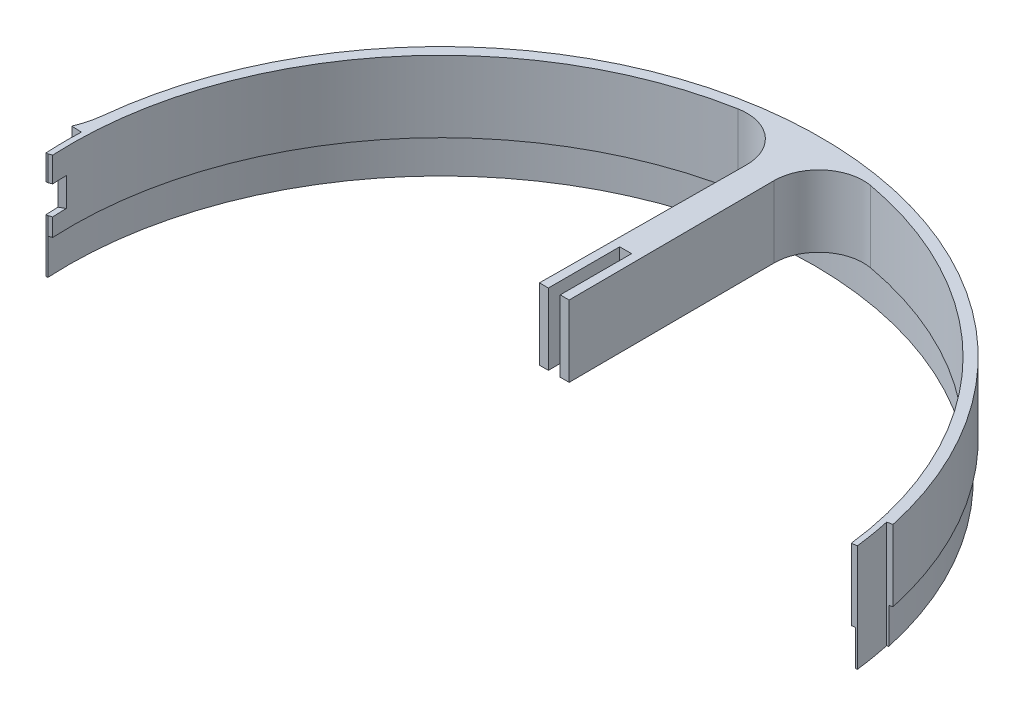
ISO-10303-21;
HEADER;
FILE_DESCRIPTION(('STEP AP214'),'2;1');
FILE_NAME('part.step','',(''),(''),'','','');
FILE_SCHEMA(('AUTOMOTIVE_DESIGN { 1 0 10303 214 1 1 1 1 }'));
ENDSEC;
DATA;
#1=APPLICATION_CONTEXT('core data for automotive mechanical design processes');
#2=APPLICATION_PROTOCOL_DEFINITION('international standard','automotive_design',2000,#1);
#3=PRODUCT_CONTEXT('',#1,'mechanical');
#4=PRODUCT('Part','Part','',(#3));
#5=PRODUCT_RELATED_PRODUCT_CATEGORY('part','',(#4));
#6=PRODUCT_DEFINITION_FORMATION('','',#4);
#7=PRODUCT_DEFINITION_CONTEXT('part definition',#1,'design');
#8=PRODUCT_DEFINITION('design','',#6,#7);
#9=PRODUCT_DEFINITION_SHAPE('','',#8);
#10=(LENGTH_UNIT() NAMED_UNIT(*) SI_UNIT(.MILLI.,.METRE.));
#11=(NAMED_UNIT(*) PLANE_ANGLE_UNIT() SI_UNIT($,.RADIAN.));
#12=(NAMED_UNIT(*) SI_UNIT($,.STERADIAN.) SOLID_ANGLE_UNIT());
#13=UNCERTAINTY_MEASURE_WITH_UNIT(LENGTH_MEASURE(1.E-05),#10,'distance_accuracy_value','');
#14=(GEOMETRIC_REPRESENTATION_CONTEXT(3) GLOBAL_UNCERTAINTY_ASSIGNED_CONTEXT((#13)) GLOBAL_UNIT_ASSIGNED_CONTEXT((#10,
#11,#12)) REPRESENTATION_CONTEXT('',''));
#15=CARTESIAN_POINT('',(0.,0.,0.));
#16=DIRECTION('',(0.,0.,1.));
#17=DIRECTION('',(1.,0.,0.));
#18=AXIS2_PLACEMENT_3D('',#15,#16,#17);
#19=CARTESIAN_POINT('',(4.19434343851814,-10.01,-31.7606710281651));
#20=DIRECTION('',(-0.000538956998216711,0.,0.999999854762666));
#21=DIRECTION('',(0.999999854762667,0.,0.000538956998216711));
#22=AXIS2_PLACEMENT_3D('',#19,#20,#21);
#23=PLANE('',#22);
#24=DIRECTION('',(0.,1.,0.));
#25=VECTOR('',#24,1.);
#26=CARTESIAN_POINT('',(1.69434380161148,-10.01,-31.7620184206606));
#27=LINE('',#26,#25);
#28=CARTESIAN_POINT('',(1.69434380161148,0.,-31.7620184206606));
#29=VERTEX_POINT('',#28);
#30=CARTESIAN_POINT('',(1.69434380161148,20.,-31.7620184206606));
#31=VERTEX_POINT('',#30);
#32=EDGE_CURVE('E11',#29,#31,#27,.T.);
#33=ORIENTED_EDGE('',*,*,#32,.F.);
#34=DIRECTION('',(0.999999854762667,0.,0.000538956998216711));
#35=VECTOR('',#34,1.);
#36=CARTESIAN_POINT('',(0.0171188517829937,0.,-31.7629223729162));
#37=LINE('',#36,#35);
#38=CARTESIAN_POINT('',(4.19434343851814,0.,-31.7606710281651));
#39=VERTEX_POINT('',#38);
#40=EDGE_CURVE('E246',#29,#39,#37,.T.);
#41=ORIENTED_EDGE('',*,*,#40,.T.);
#42=DIRECTION('',(0.,1.,0.));
#43=VECTOR('',#42,1.);
#44=CARTESIAN_POINT('',(4.19434343851814,0.,-31.7606710281651));
#45=LINE('',#44,#43);
#46=CARTESIAN_POINT('',(4.19434343851814,20.,-31.7606710281651));
#47=VERTEX_POINT('',#46);
#48=EDGE_CURVE('E226',#39,#47,#45,.T.);
#49=ORIENTED_EDGE('',*,*,#48,.T.);
#50=DIRECTION('',(0.999999854762667,0.,0.000538956998216711));
#51=VECTOR('',#50,1.);
#52=CARTESIAN_POINT('',(0.0171188517829937,20.,-31.7629223729162));
#53=LINE('',#52,#51);
#54=EDGE_CURVE('E236',#31,#47,#53,.T.);
#55=ORIENTED_EDGE('',*,*,#54,.F.);
#56=EDGE_LOOP('',(#33,#41,#49,#55));
#57=FACE_BOUND('',#56,.T.);
#58=ADVANCED_FACE('F31',(#57),#23,.T.);
#59=CARTESIAN_POINT('',(1.69434380161148,-10.01,-31.7620184206606));
#60=DIRECTION('',(-1.,0.,0.));
#61=DIRECTION('',(0.,0.,1.));
#62=AXIS2_PLACEMENT_3D('',#59,#60,#61);
#63=PLANE('',#62);
#64=DIRECTION('',(0.,1.,0.));
#65=VECTOR('',#64,1.);
#66=CARTESIAN_POINT('',(1.69434380161148,-10.01,-51.7620184206606));
#67=LINE('',#66,#65);
#68=CARTESIAN_POINT('',(1.69434380161148,0.,-51.7620184206606));
#69=VERTEX_POINT('',#68);
#70=CARTESIAN_POINT('',(1.69434380161148,20.,-51.7620184206606));
#71=VERTEX_POINT('',#70);
#72=EDGE_CURVE('E40',#69,#71,#67,.T.);
#73=ORIENTED_EDGE('',*,*,#72,.F.);
#74=DIRECTION('',(0.,0.,1.));
#75=VECTOR('',#74,1.);
#76=CARTESIAN_POINT('',(1.69434380161148,0.,0.));
#77=LINE('',#76,#75);
#78=EDGE_CURVE('E382',#69,#29,#77,.T.);
#79=ORIENTED_EDGE('',*,*,#78,.T.);
#80=ORIENTED_EDGE('',*,*,#32,.T.);
#81=DIRECTION('',(0.,0.,1.));
#82=VECTOR('',#81,1.);
#83=CARTESIAN_POINT('',(1.69434380161148,20.,0.));
#84=LINE('',#83,#82);
#85=EDGE_CURVE('E240',#71,#31,#84,.T.);
#86=ORIENTED_EDGE('',*,*,#85,.F.);
#87=EDGE_LOOP('',(#73,#79,#80,#86));
#88=FACE_BOUND('',#87,.T.);
#89=ADVANCED_FACE('F552',(#88),#63,.T.);
#90=CARTESIAN_POINT('',(1.69434380161148,-10.01,-51.7620184206606));
#91=DIRECTION('',(0.,0.,1.));
#92=DIRECTION('',(1.,0.,0.));
#93=AXIS2_PLACEMENT_3D('',#90,#91,#92);
#94=PLANE('',#93);
#95=DIRECTION('',(0.,1.,0.));
#96=VECTOR('',#95,1.);
#97=CARTESIAN_POINT('',(-1.63670515697653,-10.01,-51.7620184206606));
#98=LINE('',#97,#96);
#99=CARTESIAN_POINT('',(-1.63670515697653,0.,-51.7620184206606));
#100=VERTEX_POINT('',#99);
#101=CARTESIAN_POINT('',(-1.63670515697653,20.,-51.7620184206606));
#102=VERTEX_POINT('',#101);
#103=EDGE_CURVE('E448',#100,#102,#98,.T.);
#104=ORIENTED_EDGE('',*,*,#103,.F.);
#105=DIRECTION('',(1.,0.,0.));
#106=VECTOR('',#105,1.);
#107=CARTESIAN_POINT('',(0.,0.,-51.7620184206606));
#108=LINE('',#107,#106);
#109=EDGE_CURVE('E379',#100,#69,#108,.T.);
#110=ORIENTED_EDGE('',*,*,#109,.T.);
#111=ORIENTED_EDGE('',*,*,#72,.T.);
#112=DIRECTION('',(1.,0.,0.));
#113=VECTOR('',#112,1.);
#114=CARTESIAN_POINT('',(0.,20.,-51.7620184206606));
#115=LINE('',#114,#113);
#116=EDGE_CURVE('E332',#102,#71,#115,.T.);
#117=ORIENTED_EDGE('',*,*,#116,.F.);
#118=EDGE_LOOP('',(#104,#110,#111,#117));
#119=FACE_BOUND('',#118,.T.);
#120=ADVANCED_FACE('F555',(#119),#94,.T.);
#121=CARTESIAN_POINT('',(-4.13670479388319,-10.01,-31.7651611055646));
#122=DIRECTION('',(-0.000538956998216711,0.,0.999999854762666));
#123=DIRECTION('',(0.999999854762667,0.,0.000538956998216711));
#124=AXIS2_PLACEMENT_3D('',#121,#122,#123);
#125=PLANE('',#124);
#126=DIRECTION('',(0.,1.,0.));
#127=VECTOR('',#126,1.);
#128=CARTESIAN_POINT('',(-4.13670479388319,0.,-31.7651611055646));
#129=LINE('',#128,#127);
#130=CARTESIAN_POINT('',(-4.13670479388319,0.,-31.7651611055646));
#131=VERTEX_POINT('',#130);
#132=CARTESIAN_POINT('',(-4.13670479388319,20.,-31.7651611055646));
#133=VERTEX_POINT('',#132);
#134=EDGE_CURVE('E304',#131,#133,#129,.T.);
#135=ORIENTED_EDGE('',*,*,#134,.F.);
#136=DIRECTION('',(0.999999854762667,0.,0.000538956998216711));
#137=VECTOR('',#136,1.);
#138=CARTESIAN_POINT('',(0.0171188517829937,0.,-31.7629223729162));
#139=LINE('',#138,#137);
#140=CARTESIAN_POINT('',(-1.63670515697653,0.,-31.763813713069));
#141=VERTEX_POINT('',#140);
#142=EDGE_CURVE('E373',#131,#141,#139,.T.);
#143=ORIENTED_EDGE('',*,*,#142,.T.);
#144=DIRECTION('',(0.,1.,0.));
#145=VECTOR('',#144,1.);
#146=CARTESIAN_POINT('',(-1.63670515697653,-10.01,-31.763813713069));
#147=LINE('',#146,#145);
#148=CARTESIAN_POINT('',(-1.63670515697653,20.,-31.763813713069));
#149=VERTEX_POINT('',#148);
#150=EDGE_CURVE('E450',#141,#149,#147,.T.);
#151=ORIENTED_EDGE('',*,*,#150,.T.);
#152=DIRECTION('',(0.999999854762667,0.,0.000538956998216711));
#153=VECTOR('',#152,1.);
#154=CARTESIAN_POINT('',(0.0171188517829937,20.,-31.7629223729162));
#155=LINE('',#154,#153);
#156=EDGE_CURVE('E337',#133,#149,#155,.T.);
#157=ORIENTED_EDGE('',*,*,#156,.F.);
#158=EDGE_LOOP('',(#135,#143,#151,#157));
#159=FACE_BOUND('',#158,.T.);
#160=ADVANCED_FACE('F549',(#159),#125,.T.);
#161=CARTESIAN_POINT('',(-1.63670515697653,-10.01,-51.7620184206606));
#162=DIRECTION('',(1.,0.,0.));
#163=DIRECTION('',(0.,0.,-1.));
#164=AXIS2_PLACEMENT_3D('',#161,#162,#163);
#165=PLANE('',#164);
#166=ORIENTED_EDGE('',*,*,#150,.F.);
#167=DIRECTION('',(0.,0.,-1.));
#168=VECTOR('',#167,1.);
#169=CARTESIAN_POINT('',(-1.63670515697652,0.,0.));
#170=LINE('',#169,#168);
#171=EDGE_CURVE('E376',#141,#100,#170,.T.);
#172=ORIENTED_EDGE('',*,*,#171,.T.);
#173=ORIENTED_EDGE('',*,*,#103,.T.);
#174=DIRECTION('',(0.,0.,-1.));
#175=VECTOR('',#174,1.);
#176=CARTESIAN_POINT('',(-1.63670515697652,20.,0.));
#177=LINE('',#176,#175);
#178=EDGE_CURVE('E334',#149,#102,#177,.T.);
#179=ORIENTED_EDGE('',*,*,#178,.F.);
#180=EDGE_LOOP('',(#166,#172,#173,#179));
#181=FACE_BOUND('',#180,.T.);
#182=ADVANCED_FACE('F526',(#181),#165,.T.);
#183=CARTESIAN_POINT('',(102.593288261805,-10.01,-22.3521185490343));
#184=DIRECTION('',(0.212877319514615,0.,0.977078935826718));
#185=DIRECTION('',(0.977078935826718,0.,-0.212877319514615));
#186=AXIS2_PLACEMENT_3D('',#183,#184,#185);
#187=PLANE('',#186);
#188=DIRECTION('',(0.,1.,0.));
#189=VECTOR('',#188,1.);
#190=CARTESIAN_POINT('',(103.081827729719,-10.,-22.4585572087916));
#191=LINE('',#190,#189);
#192=CARTESIAN_POINT('',(103.081827729719,-10.,-22.4585572087916));
#193=VERTEX_POINT('',#192);
#194=CARTESIAN_POINT('',(103.081827729719,0.,-22.4585572087916));
#195=VERTEX_POINT('',#194);
#196=EDGE_CURVE('E250',#193,#195,#191,.T.);
#197=ORIENTED_EDGE('',*,*,#196,.T.);
#198=DIRECTION('',(0.977078935826718,0.,-0.212877319514615));
#199=VECTOR('',#198,1.);
#200=CARTESIAN_POINT('',(0.,0.,2.57634188714879E-13));
#201=LINE('',#200,#199);
#202=CARTESIAN_POINT('',(104.058906665546,0.,-22.6714345283063));
#203=VERTEX_POINT('',#202);
#204=EDGE_CURVE('E361',#195,#203,#201,.T.);
#205=ORIENTED_EDGE('',*,*,#204,.T.);
#206=DIRECTION('',(0.,-1.,0.));
#207=VECTOR('',#206,1.);
#208=CARTESIAN_POINT('',(104.058906665546,20.,-22.6714345283063));
#209=LINE('',#208,#207);
#210=CARTESIAN_POINT('',(104.058906665546,20.,-22.6714345283063));
#211=VERTEX_POINT('',#210);
#212=EDGE_CURVE('E389',#203,#211,#209,.F.);
#213=ORIENTED_EDGE('',*,*,#212,.T.);
#214=DIRECTION('',(0.977078935826718,0.,-0.212877319514615));
#215=VECTOR('',#214,1.);
#216=CARTESIAN_POINT('',(0.,20.,2.57634188714879E-13));
#217=LINE('',#216,#215);
#218=CARTESIAN_POINT('',(102.593288261805,20.,-22.3521185490343));
#219=VERTEX_POINT('',#218);
#220=EDGE_CURVE('E352',#219,#211,#217,.T.);
#221=ORIENTED_EDGE('',*,*,#220,.F.);
#222=DIRECTION('',(0.,1.,0.));
#223=VECTOR('',#222,1.);
#224=CARTESIAN_POINT('',(102.593288261805,-10.01,-22.3521185490343));
#225=LINE('',#224,#223);
#226=CARTESIAN_POINT('',(102.593288261805,-10.,-22.3521185490343));
#227=VERTEX_POINT('',#226);
#228=EDGE_CURVE('E294',#227,#219,#225,.T.);
#229=ORIENTED_EDGE('',*,*,#228,.F.);
#230=DIRECTION('',(-0.977078935826718,0.,0.212877319514615));
#231=VECTOR('',#230,1.);
#232=CARTESIAN_POINT('',(0.,-10.,2.57634188714879E-13));
#233=LINE('',#232,#231);
#234=EDGE_CURVE('E321',#193,#227,#233,.T.);
#235=ORIENTED_EDGE('',*,*,#234,.F.);
#236=EDGE_LOOP('',(#197,#205,#213,#221,#229,#235));
#237=FACE_BOUND('',#236,.T.);
#238=ADVANCED_FACE('F496',(#237),#187,.T.);
#239=CARTESIAN_POINT('',(101.644150293604,-10.01,-12.0837897784012));
#240=DIRECTION('',(0.154157603158477,0.,0.98804627087421));
#241=DIRECTION('',(0.98804627087421,0.,-0.154157603158477));
#242=AXIS2_PLACEMENT_3D('',#239,#240,#241);
#243=PLANE('',#242);
#244=DIRECTION('',(0.98804627087421,0.,-0.154157603158477));
#245=VECTOR('',#244,1.);
#246=CARTESIAN_POINT('',(0.574988614093037,20.,3.68528923847967));
#247=LINE('',#246,#245);
#248=CARTESIAN_POINT('',(102.771351878859,20.,-12.2596587632674));
#249=VERTEX_POINT('',#248);
#250=CARTESIAN_POINT('',(104.25437082838,20.,-12.4910433182584));
#251=VERTEX_POINT('',#250);
#252=EDGE_CURVE('E358',#249,#251,#247,.T.);
#253=ORIENTED_EDGE('',*,*,#252,.F.);
#254=DIRECTION('',(0.,1.,0.));
#255=VECTOR('',#254,1.);
#256=CARTESIAN_POINT('',(102.771351878859,0.,-12.2596587632674));
#257=LINE('',#256,#255);
#258=CARTESIAN_POINT('',(102.771351878859,0.,-12.2596587632674));
#259=VERTEX_POINT('',#258);
#260=EDGE_CURVE('E386',#249,#259,#257,.F.);
#261=ORIENTED_EDGE('',*,*,#260,.T.);
#262=DIRECTION('',(0.98804627087421,0.,-0.154157603158477));
#263=VECTOR('',#262,1.);
#264=CARTESIAN_POINT('',(0.574988614093037,0.,3.68528923847967));
#265=LINE('',#264,#263);
#266=CARTESIAN_POINT('',(103.760034210288,0.,-12.4139156062828));
#267=VERTEX_POINT('',#266);
#268=EDGE_CURVE('E367',#259,#267,#265,.T.);
#269=ORIENTED_EDGE('',*,*,#268,.T.);
#270=DIRECTION('',(0.,1.,0.));
#271=VECTOR('',#270,1.);
#272=CARTESIAN_POINT('',(103.760034210288,-10.,-12.4139156062828));
#273=LINE('',#272,#271);
#274=CARTESIAN_POINT('',(103.760034210288,-10.,-12.4139156062828));
#275=VERTEX_POINT('',#274);
#276=EDGE_CURVE('E310',#275,#267,#273,.T.);
#277=ORIENTED_EDGE('',*,*,#276,.F.);
#278=DIRECTION('',(-0.98804627087421,0.,0.154157603158477));
#279=VECTOR('',#278,1.);
#280=CARTESIAN_POINT('',(0.574988614093037,-10.,3.68528923847967));
#281=LINE('',#280,#279);
#282=CARTESIAN_POINT('',(104.25437082838,-10.,-12.4910433182584));
#283=VERTEX_POINT('',#282);
#284=EDGE_CURVE('E327',#283,#275,#281,.T.);
#285=ORIENTED_EDGE('',*,*,#284,.F.);
#286=DIRECTION('',(0.,1.,0.));
#287=VECTOR('',#286,1.);
#288=CARTESIAN_POINT('',(104.25437082838,-10.01,-12.4910433182584));
#289=LINE('',#288,#287);
#290=EDGE_CURVE('E289',#283,#251,#289,.T.);
#291=ORIENTED_EDGE('',*,*,#290,.T.);
#292=EDGE_LOOP('',(#253,#261,#269,#277,#285,#291));
#293=FACE_BOUND('',#292,.T.);
#294=ADVANCED_FACE('F508',(#293),#243,.T.);
#295=CARTESIAN_POINT('',(0.,-10.01,0.));
#296=DIRECTION('',(0.,1.,0.));
#297=DIRECTION('',(0.,0.,1.));
#298=AXIS2_PLACEMENT_3D('',#295,#296,#297);
#299=CYLINDRICAL_SURFACE('',#298,105.);
#300=CARTESIAN_POINT('',(0.,-10.,0.));
#301=DIRECTION('',(0.,-1.,0.));
#302=DIRECTION('',(0.,0.,-1.));
#303=AXIS2_PLACEMENT_3D('',#300,#301,#302);
#304=CIRCLE('',#303,105.);
#305=EDGE_CURVE('E324',#227,#283,#304,.T.);
#306=ORIENTED_EDGE('',*,*,#305,.F.);
#307=ORIENTED_EDGE('',*,*,#228,.T.);
#308=CARTESIAN_POINT('',(0.,20.,0.));
#309=DIRECTION('',(0.,1.,0.));
#310=DIRECTION('',(0.,0.,1.));
#311=AXIS2_PLACEMENT_3D('',#308,#309,#310);
#312=CIRCLE('',#311,105.);
#313=EDGE_CURVE('E355',#251,#219,#312,.T.);
#314=ORIENTED_EDGE('',*,*,#313,.F.);
#315=ORIENTED_EDGE('',*,*,#290,.F.);
#316=EDGE_LOOP('',(#306,#307,#314,#315));
#317=FACE_BOUND('',#316,.T.);
#318=ADVANCED_FACE('F547',(#317),#299,.T.);
#319=CARTESIAN_POINT('',(-104.338433281217,-10.01,5.80872967360081));
#320=DIRECTION('',(0.351109044133656,0.,0.936334576488314));
#321=DIRECTION('',(0.936334576488314,0.,-0.351109044133656));
#322=AXIS2_PLACEMENT_3D('',#319,#320,#321);
#323=PLANE('',#322);
#324=DIRECTION('',(0.936334576488314,0.,-0.351109044133656));
#325=VECTOR('',#324,1.);
#326=CARTESIAN_POINT('',(-98.344458732091,13.,3.56109434393244));
#327=LINE('',#326,#325);
#328=CARTESIAN_POINT('',(-104.338433281217,13.,5.80872967360081));
#329=VERTEX_POINT('',#328);
#330=CARTESIAN_POINT('',(-103.356901478127,13.,5.44067246218984));
#331=VERTEX_POINT('',#330);
#332=EDGE_CURVE('E405',#329,#331,#327,.T.);
#333=ORIENTED_EDGE('',*,*,#332,.T.);
#334=DIRECTION('',(0.,1.,0.));
#335=VECTOR('',#334,1.);
#336=CARTESIAN_POINT('',(-103.356901478127,0.,5.44067246218984));
#337=LINE('',#336,#335);
#338=CARTESIAN_POINT('',(-103.356901478127,20.,5.44067246218984));
#339=VERTEX_POINT('',#338);
#340=EDGE_CURVE('E393',#331,#339,#337,.T.);
#341=ORIENTED_EDGE('',*,*,#340,.T.);
#342=DIRECTION('',(0.936334576488314,0.,-0.351109044133656));
#343=VECTOR('',#342,1.);
#344=CARTESIAN_POINT('',(-10.9529355104062,20.,-29.20919413439));
#345=LINE('',#344,#343);
#346=CARTESIAN_POINT('',(-104.338433281217,20.,5.8087296736008));
#347=VERTEX_POINT('',#346);
#348=EDGE_CURVE('E340',#347,#339,#345,.T.);
#349=ORIENTED_EDGE('',*,*,#348,.F.);
#350=DIRECTION('',(0.,1.,0.));
#351=VECTOR('',#350,1.);
#352=CARTESIAN_POINT('',(-104.338433281217,-10.01,5.80872967360081));
#353=LINE('',#352,#351);
#354=EDGE_CURVE('E452',#329,#347,#353,.T.);
#355=ORIENTED_EDGE('',*,*,#354,.F.);
#356=EDGE_LOOP('',(#333,#341,#349,#355));
#357=FACE_BOUND('',#356,.T.);
#358=ADVANCED_FACE('F538',(#357),#323,.T.);
#359=CARTESIAN_POINT('',(-104.917434708559,-10.01,-4.16315915805722));
#360=DIRECTION('',(-0.0396491348386409,0.,0.999213663891035));
#361=DIRECTION('',(0.999213663891035,0.,0.0396491348386409));
#362=AXIS2_PLACEMENT_3D('',#359,#360,#361);
#363=PLANE('',#362);
#364=DIRECTION('',(0.,-1.,0.));
#365=VECTOR('',#364,1.);
#366=CARTESIAN_POINT('',(-107.704717992246,20.,-4.27375949784646));
#367=LINE('',#366,#365);
#368=CARTESIAN_POINT('',(-107.704717992246,0.,-4.27375949784646));
#369=VERTEX_POINT('',#368);
#370=CARTESIAN_POINT('',(-107.704717992246,20.,-4.27375949784646));
#371=VERTEX_POINT('',#370);
#372=EDGE_CURVE('E242',#369,#371,#367,.F.);
#373=ORIENTED_EDGE('',*,*,#372,.F.);
#374=DIRECTION('',(0.999213663891035,0.,0.0396491348386409));
#375=VECTOR('',#374,1.);
#376=CARTESIAN_POINT('',(0.,0.,0.));
#377=LINE('',#376,#375);
#378=CARTESIAN_POINT('',(-105.417041540504,0.,-4.18298372547654));
#379=VERTEX_POINT('',#378);
#380=EDGE_CURVE('E364',#369,#379,#377,.T.);
#381=ORIENTED_EDGE('',*,*,#380,.T.);
#382=DIRECTION('',(0.,1.,0.));
#383=VECTOR('',#382,1.);
#384=CARTESIAN_POINT('',(-105.417041540504,-10.,-4.18298372547654));
#385=LINE('',#384,#383);
#386=CARTESIAN_POINT('',(-105.417041540504,-10.,-4.18298372547654));
#387=VERTEX_POINT('',#386);
#388=EDGE_CURVE('E247',#379,#387,#385,.F.);
#389=ORIENTED_EDGE('',*,*,#388,.T.);
#390=DIRECTION('',(-0.999213663891035,0.,-0.0396491348386409));
#391=VECTOR('',#390,1.);
#392=CARTESIAN_POINT('',(0.,-10.,0.));
#393=LINE('',#392,#391);
#394=CARTESIAN_POINT('',(-104.917434708559,-10.,-4.16315915805723));
#395=VERTEX_POINT('',#394);
#396=EDGE_CURVE('E318',#395,#387,#393,.T.);
#397=ORIENTED_EDGE('',*,*,#396,.F.);
#398=DIRECTION('',(0.,1.,0.));
#399=VECTOR('',#398,1.);
#400=CARTESIAN_POINT('',(-104.917434708559,-10.01,-4.16315915805723));
#401=LINE('',#400,#399);
#402=CARTESIAN_POINT('',(-104.917434708559,20.,-4.16315915805723));
#403=VERTEX_POINT('',#402);
#404=EDGE_CURVE('E300',#395,#403,#401,.T.);
#405=ORIENTED_EDGE('',*,*,#404,.T.);
#406=DIRECTION('',(0.999213663891035,0.,0.0396491348386409));
#407=VECTOR('',#406,1.);
#408=CARTESIAN_POINT('',(0.,20.,0.));
#409=LINE('',#408,#407);
#410=EDGE_CURVE('E349',#371,#403,#409,.T.);
#411=ORIENTED_EDGE('',*,*,#410,.F.);
#412=EDGE_LOOP('',(#373,#381,#389,#397,#405,#411));
#413=FACE_BOUND('',#412,.T.);
#414=ADVANCED_FACE('F484',(#413),#363,.T.);
#415=CARTESIAN_POINT('',(-104.338433281217,-10.01,5.80872967360081));
#416=DIRECTION('',(0.0555859298909143,0.,0.998453906997295));
#417=DIRECTION('',(0.998453906997295,0.,-0.0555859298909143));
#418=AXIS2_PLACEMENT_3D('',#415,#416,#417);
#419=PLANE('',#418);
#420=CARTESIAN_POINT('',(-104.338433281217,0.,5.80872967360081));
#421=VERTEX_POINT('',#420);
#422=CARTESIAN_POINT('',(-104.338433281217,5.,5.80872967360081));
#423=VERTEX_POINT('',#422);
#424=EDGE_CURVE('E454',#421,#423,#353,.T.);
#425=ORIENTED_EDGE('',*,*,#424,.T.);
#426=DIRECTION('',(-0.998453906997295,0.,0.0555859298909143));
#427=VECTOR('',#426,1.);
#428=CARTESIAN_POINT('',(-99.5478227413911,5.,5.54202678452875));
#429=LINE('',#428,#427);
#430=CARTESIAN_POINT('',(-104.837660234716,5.,5.83652263854626));
#431=VERTEX_POINT('',#430);
#432=EDGE_CURVE('E411',#423,#431,#429,.T.);
#433=ORIENTED_EDGE('',*,*,#432,.T.);
#434=DIRECTION('',(0.,1.,0.));
#435=VECTOR('',#434,1.);
#436=CARTESIAN_POINT('',(-104.837660234716,-10.01,5.83652263854626));
#437=LINE('',#436,#435);
#438=CARTESIAN_POINT('',(-104.837660234716,-10.,5.83652263854626));
#439=VERTEX_POINT('',#438);
#440=EDGE_CURVE('E456',#439,#431,#437,.T.);
#441=ORIENTED_EDGE('',*,*,#440,.F.);
#442=DIRECTION('',(-0.998453906997295,0.,0.0555859298909143));
#443=VECTOR('',#442,1.);
#444=CARTESIAN_POINT('',(0.,-10.,2.57208152674122E-13));
#445=LINE('',#444,#443);
#446=CARTESIAN_POINT('',(-104.338433281217,-10.,5.80872967360081));
#447=VERTEX_POINT('',#446);
#448=EDGE_CURVE('E312',#447,#439,#445,.T.);
#449=ORIENTED_EDGE('',*,*,#448,.F.);
#450=DIRECTION('',(0.,1.,0.));
#451=VECTOR('',#450,1.);
#452=CARTESIAN_POINT('',(-104.338433281217,-10.,5.80872967360081));
#453=LINE('',#452,#451);
#454=EDGE_CURVE('E307',#421,#447,#453,.F.);
#455=ORIENTED_EDGE('',*,*,#454,.F.);
#456=EDGE_LOOP('',(#425,#433,#441,#449,#455));
#457=FACE_BOUND('',#456,.T.);
#458=ADVANCED_FACE('F468',(#457),#419,.T.);
#459=ORIENTED_EDGE('',*,*,#424,.F.);
#460=DIRECTION('',(0.936334576488314,0.,-0.351109044133656));
#461=VECTOR('',#460,1.);
#462=CARTESIAN_POINT('',(-10.9529355104062,0.,-29.20919413439));
#463=LINE('',#462,#461);
#464=CARTESIAN_POINT('',(-103.356901478127,0.,5.44067246218984));
#465=VERTEX_POINT('',#464);
#466=EDGE_CURVE('E370',#421,#465,#463,.T.);
#467=ORIENTED_EDGE('',*,*,#466,.T.);
#468=CARTESIAN_POINT('',(-103.356901478127,5.,5.44067246218984));
#469=VERTEX_POINT('',#468);
#470=EDGE_CURVE('E392',#465,#469,#337,.T.);
#471=ORIENTED_EDGE('',*,*,#470,.T.);
#472=DIRECTION('',(-0.936334576488314,0.,0.351109044133656));
#473=VECTOR('',#472,1.);
#474=CARTESIAN_POINT('',(-98.344458732091,5.,3.56109434393244));
#475=LINE('',#474,#473);
#476=EDGE_CURVE('E414',#469,#423,#475,.T.);
#477=ORIENTED_EDGE('',*,*,#476,.T.);
#478=EDGE_LOOP('',(#459,#467,#471,#477));
#479=FACE_BOUND('',#478,.T.);
#480=ADVANCED_FACE('F544',(#479),#323,.T.);
#481=CARTESIAN_POINT('',(0.,-10.01,0.));
#482=DIRECTION('',(0.,1.,0.));
#483=DIRECTION('',(0.,0.,1.));
#484=AXIS2_PLACEMENT_3D('',#481,#482,#483);
#485=CYLINDRICAL_SURFACE('',#484,105.);
#486=DIRECTION('',(0.,1.,0.));
#487=VECTOR('',#486,1.);
#488=CARTESIAN_POINT('',(-104.973760616754,-10.01,2.34724987517181));
#489=LINE('',#488,#487);
#490=CARTESIAN_POINT('',(-104.973760616754,5.,2.34724987517181));
#491=VERTEX_POINT('',#490);
#492=CARTESIAN_POINT('',(-104.973760616754,13.,2.34724987517181));
#493=VERTEX_POINT('',#492);
#494=EDGE_CURVE('E396',#491,#493,#489,.T.);
#495=ORIENTED_EDGE('',*,*,#494,.T.);
#496=CARTESIAN_POINT('',(0.,13.,0.));
#497=DIRECTION('',(0.,1.,0.));
#498=DIRECTION('',(0.,0.,1.));
#499=AXIS2_PLACEMENT_3D('',#496,#497,#498);
#500=CIRCLE('',#499,105.);
#501=CARTESIAN_POINT('',(-104.837660234716,13.,5.83652263854626));
#502=VERTEX_POINT('',#501);
#503=EDGE_CURVE('E399',#493,#502,#500,.T.);
#504=ORIENTED_EDGE('',*,*,#503,.T.);
#505=CARTESIAN_POINT('',(-104.837660234716,20.,5.83652263854626));
#506=VERTEX_POINT('',#505);
#507=EDGE_CURVE('E455',#502,#506,#437,.T.);
#508=ORIENTED_EDGE('',*,*,#507,.T.);
#509=CARTESIAN_POINT('',(0.,20.,0.));
#510=DIRECTION('',(0.,1.,0.));
#511=DIRECTION('',(0.,0.,1.));
#512=AXIS2_PLACEMENT_3D('',#509,#510,#511);
#513=CIRCLE('',#512,105.);
#514=EDGE_CURVE('E346',#403,#506,#513,.T.);
#515=ORIENTED_EDGE('',*,*,#514,.F.);
#516=ORIENTED_EDGE('',*,*,#404,.F.);
#517=CARTESIAN_POINT('',(0.,-10.,0.));
#518=DIRECTION('',(0.,-1.,0.));
#519=DIRECTION('',(0.,0.,-1.));
#520=AXIS2_PLACEMENT_3D('',#517,#518,#519);
#521=CIRCLE('',#520,105.);
#522=EDGE_CURVE('E315',#439,#395,#521,.T.);
#523=ORIENTED_EDGE('',*,*,#522,.F.);
#524=ORIENTED_EDGE('',*,*,#440,.T.);
#525=CARTESIAN_POINT('',(0.,5.,0.));
#526=DIRECTION('',(0.,-1.,0.));
#527=DIRECTION('',(0.,0.,-1.));
#528=AXIS2_PLACEMENT_3D('',#525,#526,#527);
#529=CIRCLE('',#528,105.);
#530=EDGE_CURVE('E408',#431,#491,#529,.T.);
#531=ORIENTED_EDGE('',*,*,#530,.T.);
#532=EDGE_LOOP('',(#495,#504,#508,#515,#516,#523,#524,#531));
#533=FACE_BOUND('',#532,.T.);
#534=ADVANCED_FACE('F463',(#533),#485,.T.);
#535=ORIENTED_EDGE('',*,*,#507,.F.);
#536=DIRECTION('',(0.998453906997295,0.,-0.0555859298909143));
#537=VECTOR('',#536,1.);
#538=CARTESIAN_POINT('',(-99.5478227413911,13.,5.54202678452875));
#539=LINE('',#538,#537);
#540=EDGE_CURVE('E402',#502,#329,#539,.T.);
#541=ORIENTED_EDGE('',*,*,#540,.T.);
#542=ORIENTED_EDGE('',*,*,#354,.T.);
#543=DIRECTION('',(0.998453906997295,0.,-0.0555859298909143));
#544=VECTOR('',#543,1.);
#545=CARTESIAN_POINT('',(0.,20.,2.57208152674122E-13));
#546=LINE('',#545,#544);
#547=EDGE_CURVE('E343',#506,#347,#546,.T.);
#548=ORIENTED_EDGE('',*,*,#547,.F.);
#549=EDGE_LOOP('',(#535,#541,#542,#548));
#550=FACE_BOUND('',#549,.T.);
#551=ADVANCED_FACE('F481',(#550),#419,.T.);
#552=CARTESIAN_POINT('',(16.4265159427415,0.,-89.5051371373893));
#553=DIRECTION('',(0.,1.,0.));
#554=DIRECTION('',(0.,0.,1.));
#555=AXIS2_PLACEMENT_3D('',#552,#553,#554);
#556=CYLINDRICAL_SURFACE('',#555,12.5);
#557=CARTESIAN_POINT('',(16.4265159427415,20.,-89.5051371373893));
#558=DIRECTION('',(0.,1.,0.));
#559=DIRECTION('',(0.866025403784436,0.,-0.500000000000004));
#560=AXIS2_PLACEMENT_3D('',#557,#558,#559);
#561=CIRCLE('',#560,12.5);
#562=CARTESIAN_POINT('',(18.6829054953159,20.,-101.799798832086));
#563=VERTEX_POINT('',#562);
#564=CARTESIAN_POINT('',(3.92665052845236,20.,-89.4471317526567));
#565=VERTEX_POINT('',#564);
#566=EDGE_CURVE('E231',#563,#565,#561,.T.);
#567=ORIENTED_EDGE('',*,*,#566,.T.);
#568=DIRECTION('',(0.,1.,0.));
#569=VECTOR('',#568,1.);
#570=CARTESIAN_POINT('',(3.92665052845236,0.,-89.4471317526567));
#571=LINE('',#570,#569);
#572=CARTESIAN_POINT('',(3.92665052845236,0.,-89.4471317526567));
#573=VERTEX_POINT('',#572);
#574=EDGE_CURVE('E227',#573,#565,#571,.T.);
#575=ORIENTED_EDGE('',*,*,#574,.F.);
#576=CARTESIAN_POINT('',(16.4265159427415,0.,-89.5051371373893));
#577=DIRECTION('',(0.,1.,0.));
#578=DIRECTION('',(0.866025403784436,0.,-0.500000000000004));
#579=AXIS2_PLACEMENT_3D('',#576,#577,#578);
#580=CIRCLE('',#579,12.5);
#581=CARTESIAN_POINT('',(18.6829054953159,0.,-101.799798832086));
#582=VERTEX_POINT('',#581);
#583=EDGE_CURVE('E257',#582,#573,#580,.T.);
#584=ORIENTED_EDGE('',*,*,#583,.F.);
#585=DIRECTION('',(0.,1.,0.));
#586=VECTOR('',#585,1.);
#587=CARTESIAN_POINT('',(18.6829054953159,0.,-101.799798832086));
#588=LINE('',#587,#586);
#589=EDGE_CURVE('E424',#582,#563,#588,.T.);
#590=ORIENTED_EDGE('',*,*,#589,.T.);
#591=EDGE_LOOP('',(#567,#575,#584,#590));
#592=FACE_BOUND('',#591,.T.);
#593=ADVANCED_FACE('F514',(#592),#556,.F.);
#594=CARTESIAN_POINT('',(-16.2551502510285,0.,-89.536417676365));
#595=DIRECTION('',(0.,1.,0.));
#596=DIRECTION('',(0.,0.,1.));
#597=AXIS2_PLACEMENT_3D('',#594,#595,#596);
#598=CYLINDRICAL_SURFACE('',#597,12.5);
#599=CARTESIAN_POINT('',(-16.2551502510285,20.,-89.536417676365));
#600=DIRECTION('',(0.,1.,0.));
#601=DIRECTION('',(-0.866025403784443,0.,-0.499999999999992));
#602=AXIS2_PLACEMENT_3D('',#599,#600,#601);
#603=CIRCLE('',#602,12.5);
#604=CARTESIAN_POINT('',(-3.7554232598627,20.,-89.4538032325801));
#605=VERTEX_POINT('',#604);
#606=CARTESIAN_POINT('',(-18.4880005602356,20.,-101.835376148393));
#607=VERTEX_POINT('',#606);
#608=EDGE_CURVE('E267',#605,#607,#603,.T.);
#609=ORIENTED_EDGE('',*,*,#608,.T.);
#610=DIRECTION('',(0.,1.,0.));
#611=VECTOR('',#610,1.);
#612=CARTESIAN_POINT('',(-18.4880005602356,0.,-101.835376148393));
#613=LINE('',#612,#611);
#614=CARTESIAN_POINT('',(-18.4880005602356,0.,-101.835376148393));
#615=VERTEX_POINT('',#614);
#616=EDGE_CURVE('E306',#615,#607,#613,.T.);
#617=ORIENTED_EDGE('',*,*,#616,.F.);
#618=CARTESIAN_POINT('',(-16.2551502510285,0.,-89.536417676365));
#619=DIRECTION('',(0.,1.,0.));
#620=DIRECTION('',(-0.866025403784443,0.,-0.499999999999992));
#621=AXIS2_PLACEMENT_3D('',#618,#619,#620);
#622=CIRCLE('',#621,12.5);
#623=CARTESIAN_POINT('',(-3.7554232598627,0.,-89.4538032325801));
#624=VERTEX_POINT('',#623);
#625=EDGE_CURVE('E263',#624,#615,#622,.T.);
#626=ORIENTED_EDGE('',*,*,#625,.F.);
#627=DIRECTION('',(0.,1.,0.));
#628=VECTOR('',#627,1.);
#629=CARTESIAN_POINT('',(-3.7554232598627,0.,-89.4538032325801));
#630=LINE('',#629,#628);
#631=EDGE_CURVE('E260',#624,#605,#630,.T.);
#632=ORIENTED_EDGE('',*,*,#631,.T.);
#633=EDGE_LOOP('',(#609,#617,#626,#632));
#634=FACE_BOUND('',#633,.T.);
#635=ADVANCED_FACE('F529',(#634),#598,.F.);
#636=CARTESIAN_POINT('',(0.,20.,0.));
#637=DIRECTION('',(0.,-1.,0.));
#638=DIRECTION('',(0.,0.,-1.));
#639=AXIS2_PLACEMENT_3D('',#636,#637,#638);
#640=CYLINDRICAL_SURFACE('',#639,106.5);
#641=ORIENTED_EDGE('',*,*,#212,.F.);
#642=CARTESIAN_POINT('',(0.,0.,0.));
#643=DIRECTION('',(0.,1.,0.));
#644=DIRECTION('',(0.,0.,1.));
#645=AXIS2_PLACEMENT_3D('',#642,#643,#644);
#646=CIRCLE('',#645,106.5);
#647=CARTESIAN_POINT('',(-105.902765841909,0.,-11.2629564073494));
#648=VERTEX_POINT('',#647);
#649=EDGE_CURVE('E254',#203,#648,#646,.T.);
#650=ORIENTED_EDGE('',*,*,#649,.T.);
#651=DIRECTION('',(0.,-1.,0.));
#652=VECTOR('',#651,1.);
#653=CARTESIAN_POINT('',(-105.902765841909,20.,-11.2629564073494));
#654=LINE('',#653,#652);
#655=CARTESIAN_POINT('',(-105.902765841909,20.,-11.2629564073494));
#656=VERTEX_POINT('',#655);
#657=EDGE_CURVE('E273',#656,#648,#654,.T.);
#658=ORIENTED_EDGE('',*,*,#657,.F.);
#659=CARTESIAN_POINT('',(0.,20.,0.));
#660=DIRECTION('',(0.,1.,0.));
#661=DIRECTION('',(0.,0.,1.));
#662=AXIS2_PLACEMENT_3D('',#659,#660,#661);
#663=CIRCLE('',#662,106.5);
#664=EDGE_CURVE('E419',#211,#656,#663,.T.);
#665=ORIENTED_EDGE('',*,*,#664,.F.);
#666=EDGE_LOOP('',(#641,#650,#658,#665));
#667=FACE_BOUND('',#666,.T.);
#668=ADVANCED_FACE('F493',(#667),#640,.T.);
#669=CARTESIAN_POINT('',(0.,20.,0.));
#670=DIRECTION('',(0.,1.,0.));
#671=DIRECTION('',(0.,0.,1.));
#672=AXIS2_PLACEMENT_3D('',#669,#670,#671);
#673=PLANE('',#672);
#674=CARTESIAN_POINT('',(0.,20.,0.));
#675=DIRECTION('',(0.,1.,0.));
#676=DIRECTION('',(0.866025403784436,0.,-0.500000000000004));
#677=AXIS2_PLACEMENT_3D('',#674,#675,#676);
#678=CIRCLE('',#677,103.5);
#679=EDGE_CURVE('E258',#249,#563,#678,.T.);
#680=ORIENTED_EDGE('',*,*,#679,.F.);
#681=ORIENTED_EDGE('',*,*,#252,.T.);
#682=ORIENTED_EDGE('',*,*,#313,.T.);
#683=ORIENTED_EDGE('',*,*,#220,.T.);
#684=ORIENTED_EDGE('',*,*,#664,.T.);
#685=CARTESIAN_POINT('',(-130.507920293036,20.,-13.8797604140818));
#686=DIRECTION('',(0.,1.,0.));
#687=DIRECTION('',(0.,0.,-1.));
#688=AXIS2_PLACEMENT_3D('',#685,#686,#687);
#689=CIRCLE('',#688,24.7439141764898);
#690=EDGE_CURVE('E269',#371,#656,#689,.T.);
#691=ORIENTED_EDGE('',*,*,#690,.F.);
#692=ORIENTED_EDGE('',*,*,#410,.T.);
#693=ORIENTED_EDGE('',*,*,#514,.T.);
#694=ORIENTED_EDGE('',*,*,#547,.T.);
#695=ORIENTED_EDGE('',*,*,#348,.T.);
#696=CARTESIAN_POINT('',(0.,20.,0.));
#697=DIRECTION('',(0.,1.,0.));
#698=DIRECTION('',(-0.866025403784443,0.,-0.499999999999992));
#699=AXIS2_PLACEMENT_3D('',#696,#697,#698);
#700=CIRCLE('',#699,103.5);
#701=EDGE_CURVE('E265',#607,#339,#700,.T.);
#702=ORIENTED_EDGE('',*,*,#701,.F.);
#703=ORIENTED_EDGE('',*,*,#608,.F.);
#704=DIRECTION('',(0.00660915550279129,0.,-0.999978159293262));
#705=VECTOR('',#704,1.);
#706=CARTESIAN_POINT('',(-4.13670479388319,20.,-31.7651611055646));
#707=LINE('',#706,#705);
#708=EDGE_CURVE('E268',#133,#605,#707,.T.);
#709=ORIENTED_EDGE('',*,*,#708,.F.);
#710=ORIENTED_EDGE('',*,*,#156,.T.);
#711=ORIENTED_EDGE('',*,*,#178,.T.);
#712=ORIENTED_EDGE('',*,*,#116,.T.);
#713=ORIENTED_EDGE('',*,*,#85,.T.);
#714=ORIENTED_EDGE('',*,*,#54,.T.);
#715=DIRECTION('',(0.00464043077860177,0.,0.999989233143132));
#716=VECTOR('',#715,1.);
#717=CARTESIAN_POINT('',(4.19434343851814,20.,-31.7606710281651));
#718=LINE('',#717,#716);
#719=EDGE_CURVE('E221',#565,#47,#718,.T.);
#720=ORIENTED_EDGE('',*,*,#719,.F.);
#721=ORIENTED_EDGE('',*,*,#566,.F.);
#722=EDGE_LOOP('',(#680,#681,#682,#683,#684,#691,#692,#693,#694,#695,#702,#703,#709,#710,#711,
#712,#713,#714,#720,#721));
#723=FACE_BOUND('',#722,.T.);
#724=ADVANCED_FACE('F237',(#723),#673,.T.);
#725=CARTESIAN_POINT('',(0.,0.,0.));
#726=DIRECTION('',(0.,1.,0.));
#727=DIRECTION('',(0.,0.,1.));
#728=AXIS2_PLACEMENT_3D('',#725,#726,#727);
#729=PLANE('',#728);
#730=ORIENTED_EDGE('',*,*,#204,.F.);
#731=CARTESIAN_POINT('',(0.,0.,0.));
#732=DIRECTION('',(0.,1.,0.));
#733=DIRECTION('',(0.,0.,1.));
#734=AXIS2_PLACEMENT_3D('',#731,#732,#733);
#735=CIRCLE('',#734,105.5);
#736=EDGE_CURVE('E309',#379,#195,#735,.F.);
#737=ORIENTED_EDGE('',*,*,#736,.F.);
#738=ORIENTED_EDGE('',*,*,#380,.F.);
#739=CARTESIAN_POINT('',(-130.507920293036,0.,-13.8797604140818));
#740=DIRECTION('',(0.,1.,0.));
#741=DIRECTION('',(0.,0.,-1.));
#742=AXIS2_PLACEMENT_3D('',#739,#740,#741);
#743=CIRCLE('',#742,24.7439141764898);
#744=EDGE_CURVE('E272',#369,#648,#743,.T.);
#745=ORIENTED_EDGE('',*,*,#744,.T.);
#746=ORIENTED_EDGE('',*,*,#649,.F.);
#747=EDGE_LOOP('',(#730,#737,#738,#745,#746));
#748=FACE_BOUND('',#747,.T.);
#749=ADVANCED_FACE('F491',(#748),#729,.F.);
#750=ORIENTED_EDGE('',*,*,#268,.F.);
#751=CARTESIAN_POINT('',(0.,0.,0.));
#752=DIRECTION('',(0.,1.,0.));
#753=DIRECTION('',(0.866025403784436,0.,-0.500000000000004));
#754=AXIS2_PLACEMENT_3D('',#751,#752,#753);
#755=CIRCLE('',#754,103.5);
#756=EDGE_CURVE('E232',#259,#582,#755,.T.);
#757=ORIENTED_EDGE('',*,*,#756,.T.);
#758=ORIENTED_EDGE('',*,*,#583,.T.);
#759=DIRECTION('',(0.00464043077860177,0.,0.999989233143132));
#760=VECTOR('',#759,1.);
#761=CARTESIAN_POINT('',(4.19434343851814,0.,-31.7606710281651));
#762=LINE('',#761,#760);
#763=EDGE_CURVE('E427',#573,#39,#762,.T.);
#764=ORIENTED_EDGE('',*,*,#763,.T.);
#765=ORIENTED_EDGE('',*,*,#40,.F.);
#766=ORIENTED_EDGE('',*,*,#78,.F.);
#767=ORIENTED_EDGE('',*,*,#109,.F.);
#768=ORIENTED_EDGE('',*,*,#171,.F.);
#769=ORIENTED_EDGE('',*,*,#142,.F.);
#770=DIRECTION('',(0.00660915550279129,0.,-0.999978159293262));
#771=VECTOR('',#770,1.);
#772=CARTESIAN_POINT('',(-4.13670479388319,0.,-31.7651611055646));
#773=LINE('',#772,#771);
#774=EDGE_CURVE('E264',#131,#624,#773,.T.);
#775=ORIENTED_EDGE('',*,*,#774,.T.);
#776=ORIENTED_EDGE('',*,*,#625,.T.);
#777=CARTESIAN_POINT('',(0.,0.,0.));
#778=DIRECTION('',(0.,1.,0.));
#779=DIRECTION('',(-0.866025403784443,0.,-0.499999999999992));
#780=AXIS2_PLACEMENT_3D('',#777,#778,#779);
#781=CIRCLE('',#780,103.5);
#782=EDGE_CURVE('E261',#615,#465,#781,.T.);
#783=ORIENTED_EDGE('',*,*,#782,.T.);
#784=ORIENTED_EDGE('',*,*,#466,.F.);
#785=CARTESIAN_POINT('',(0.,0.,0.));
#786=DIRECTION('',(0.,-1.,0.));
#787=DIRECTION('',(0.,0.,-1.));
#788=AXIS2_PLACEMENT_3D('',#785,#786,#787);
#789=CIRCLE('',#788,104.5);
#790=EDGE_CURVE('E35',#421,#267,#789,.T.);
#791=ORIENTED_EDGE('',*,*,#790,.T.);
#792=EDGE_LOOP('',(#750,#757,#758,#764,#765,#766,#767,#768,#769,#775,#776,#783,#784,#791));
#793=FACE_BOUND('',#792,.T.);
#794=ADVANCED_FACE('F503',(#793),#729,.F.);
#795=CARTESIAN_POINT('',(0.,-10.,0.));
#796=DIRECTION('',(0.,-1.,0.));
#797=DIRECTION('',(0.,0.,-1.));
#798=AXIS2_PLACEMENT_3D('',#795,#796,#797);
#799=PLANE('',#798);
#800=ORIENTED_EDGE('',*,*,#305,.T.);
#801=ORIENTED_EDGE('',*,*,#284,.T.);
#802=CARTESIAN_POINT('',(0.,-10.,0.));
#803=DIRECTION('',(0.,-1.,0.));
#804=DIRECTION('',(0.,0.,-1.));
#805=AXIS2_PLACEMENT_3D('',#802,#803,#804);
#806=CIRCLE('',#805,104.5);
#807=EDGE_CURVE('E284',#447,#275,#806,.T.);
#808=ORIENTED_EDGE('',*,*,#807,.F.);
#809=ORIENTED_EDGE('',*,*,#448,.T.);
#810=ORIENTED_EDGE('',*,*,#522,.T.);
#811=ORIENTED_EDGE('',*,*,#396,.T.);
#812=CARTESIAN_POINT('',(0.,-10.,0.));
#813=DIRECTION('',(0.,-1.,0.));
#814=DIRECTION('',(0.,0.,-1.));
#815=AXIS2_PLACEMENT_3D('',#812,#813,#814);
#816=CIRCLE('',#815,105.5);
#817=EDGE_CURVE('E283',#387,#193,#816,.T.);
#818=ORIENTED_EDGE('',*,*,#817,.T.);
#819=ORIENTED_EDGE('',*,*,#234,.T.);
#820=EDGE_LOOP('',(#800,#801,#808,#809,#810,#811,#818,#819));
#821=FACE_BOUND('',#820,.T.);
#822=ADVANCED_FACE('F502',(#821),#799,.T.);
#823=CARTESIAN_POINT('',(0.,-10.,0.));
#824=DIRECTION('',(0.,1.,0.));
#825=DIRECTION('',(0.,0.,1.));
#826=AXIS2_PLACEMENT_3D('',#823,#824,#825);
#827=CYLINDRICAL_SURFACE('',#826,104.5);
#828=ORIENTED_EDGE('',*,*,#807,.T.);
#829=ORIENTED_EDGE('',*,*,#276,.T.);
#830=ORIENTED_EDGE('',*,*,#790,.F.);
#831=ORIENTED_EDGE('',*,*,#454,.T.);
#832=EDGE_LOOP('',(#828,#829,#830,#831));
#833=FACE_BOUND('',#832,.T.);
#834=ADVANCED_FACE('F33',(#833),#827,.F.);
#835=CARTESIAN_POINT('',(0.,-10.,0.));
#836=DIRECTION('',(0.,1.,0.));
#837=DIRECTION('',(0.,0.,1.));
#838=AXIS2_PLACEMENT_3D('',#835,#836,#837);
#839=CYLINDRICAL_SURFACE('',#838,105.5);
#840=ORIENTED_EDGE('',*,*,#196,.F.);
#841=ORIENTED_EDGE('',*,*,#817,.F.);
#842=ORIENTED_EDGE('',*,*,#388,.F.);
#843=ORIENTED_EDGE('',*,*,#736,.T.);
#844=EDGE_LOOP('',(#840,#841,#842,#843));
#845=FACE_BOUND('',#844,.T.);
#846=ADVANCED_FACE('F500',(#845),#839,.T.);
#847=CARTESIAN_POINT('',(-130.507920293036,20.,-13.8797604140818));
#848=DIRECTION('',(0.,-1.,0.));
#849=DIRECTION('',(0.,0.,-1.));
#850=AXIS2_PLACEMENT_3D('',#847,#848,#849);
#851=CYLINDRICAL_SURFACE('',#850,24.7439141764898);
#852=ORIENTED_EDGE('',*,*,#744,.F.);
#853=ORIENTED_EDGE('',*,*,#372,.T.);
#854=ORIENTED_EDGE('',*,*,#690,.T.);
#855=ORIENTED_EDGE('',*,*,#657,.T.);
#856=EDGE_LOOP('',(#852,#853,#854,#855));
#857=FACE_BOUND('',#856,.T.);
#858=ADVANCED_FACE('F492',(#857),#851,.F.);
#859=CARTESIAN_POINT('',(-99.8871404140324,5.,-0.552915885798429));
#860=DIRECTION('',(-0.495305164319249,0.,-0.868719053663889));
#861=DIRECTION('',(-0.868719053663889,0.,0.495305164319249));
#862=AXIS2_PLACEMENT_3D('',#859,#860,#861);
#863=PLANE('',#862);
#864=ORIENTED_EDGE('',*,*,#494,.F.);
#865=DIRECTION('',(-0.868719053663889,0.,0.495305164319249));
#866=VECTOR('',#865,1.);
#867=CARTESIAN_POINT('',(-99.8871404140324,5.,-0.552915885798429));
#868=LINE('',#867,#866);
#869=CARTESIAN_POINT('',(-103.489118660971,5.,1.50077272612937));
#870=VERTEX_POINT('',#869);
#871=EDGE_CURVE('E281',#870,#491,#868,.T.);
#872=ORIENTED_EDGE('',*,*,#871,.F.);
#873=DIRECTION('',(0.,1.,0.));
#874=VECTOR('',#873,1.);
#875=CARTESIAN_POINT('',(-103.489118660971,0.,1.50077272612937));
#876=LINE('',#875,#874);
#877=CARTESIAN_POINT('',(-103.489118660971,13.,1.50077272612937));
#878=VERTEX_POINT('',#877);
#879=EDGE_CURVE('E276',#878,#870,#876,.F.);
#880=ORIENTED_EDGE('',*,*,#879,.F.);
#881=DIRECTION('',(-0.868719053663889,0.,0.495305164319249));
#882=VECTOR('',#881,1.);
#883=CARTESIAN_POINT('',(-99.8871404140324,13.,-0.552915885798429));
#884=LINE('',#883,#882);
#885=EDGE_CURVE('E279',#878,#493,#884,.T.);
#886=ORIENTED_EDGE('',*,*,#885,.T.);
#887=EDGE_LOOP('',(#864,#872,#880,#886));
#888=FACE_BOUND('',#887,.T.);
#889=ADVANCED_FACE('F473',(#888),#863,.F.);
#890=CARTESIAN_POINT('',(0.,0.,0.));
#891=DIRECTION('',(0.,1.,0.));
#892=DIRECTION('',(0.,0.,1.));
#893=AXIS2_PLACEMENT_3D('',#890,#891,#892);
#894=CYLINDRICAL_SURFACE('',#893,103.5);
#895=ORIENTED_EDGE('',*,*,#470,.F.);
#896=ORIENTED_EDGE('',*,*,#782,.F.);
#897=ORIENTED_EDGE('',*,*,#616,.T.);
#898=ORIENTED_EDGE('',*,*,#701,.T.);
#899=ORIENTED_EDGE('',*,*,#340,.F.);
#900=CARTESIAN_POINT('',(0.,13.,0.));
#901=DIRECTION('',(0.,1.,0.));
#902=DIRECTION('',(0.,0.,1.));
#903=AXIS2_PLACEMENT_3D('',#900,#901,#902);
#904=CIRCLE('',#903,103.5);
#905=EDGE_CURVE('E56',#331,#878,#904,.F.);
#906=ORIENTED_EDGE('',*,*,#905,.T.);
#907=ORIENTED_EDGE('',*,*,#879,.T.);
#908=CARTESIAN_POINT('',(0.,5.,0.));
#909=DIRECTION('',(0.,-1.,0.));
#910=DIRECTION('',(0.,0.,-1.));
#911=AXIS2_PLACEMENT_3D('',#908,#909,#910);
#912=CIRCLE('',#911,103.5);
#913=EDGE_CURVE('E48',#870,#469,#912,.F.);
#914=ORIENTED_EDGE('',*,*,#913,.T.);
#915=EDGE_LOOP('',(#895,#896,#897,#898,#899,#906,#907,#914));
#916=FACE_BOUND('',#915,.T.);
#917=ADVANCED_FACE('F624',(#916),#894,.F.);
#918=CARTESIAN_POINT('',(-99.8871404140324,5.,-0.552915885798429));
#919=DIRECTION('',(0.,-1.,0.));
#920=DIRECTION('',(0.,0.,-1.));
#921=AXIS2_PLACEMENT_3D('',#918,#919,#920);
#922=PLANE('',#921);
#923=ORIENTED_EDGE('',*,*,#530,.F.);
#924=ORIENTED_EDGE('',*,*,#432,.F.);
#925=ORIENTED_EDGE('',*,*,#476,.F.);
#926=ORIENTED_EDGE('',*,*,#913,.F.);
#927=ORIENTED_EDGE('',*,*,#871,.T.);
#928=EDGE_LOOP('',(#923,#924,#925,#926,#927));
#929=FACE_BOUND('',#928,.T.);
#930=ADVANCED_FACE('F470',(#929),#922,.F.);
#931=CARTESIAN_POINT('',(-99.8871404140324,13.,-0.552915885798429));
#932=DIRECTION('',(0.,1.,0.));
#933=DIRECTION('',(0.,0.,1.));
#934=AXIS2_PLACEMENT_3D('',#931,#932,#933);
#935=PLANE('',#934);
#936=ORIENTED_EDGE('',*,*,#503,.F.);
#937=ORIENTED_EDGE('',*,*,#885,.F.);
#938=ORIENTED_EDGE('',*,*,#905,.F.);
#939=ORIENTED_EDGE('',*,*,#332,.F.);
#940=ORIENTED_EDGE('',*,*,#540,.F.);
#941=EDGE_LOOP('',(#936,#937,#938,#939,#940));
#942=FACE_BOUND('',#941,.T.);
#943=ADVANCED_FACE('F478',(#942),#935,.F.);
#944=CARTESIAN_POINT('',(-4.13670479388319,0.,-31.7651611055646));
#945=DIRECTION('',(0.999978159293262,0.,0.00660915550279129));
#946=DIRECTION('',(0.00660915550279129,0.,-0.999978159293262));
#947=AXIS2_PLACEMENT_3D('',#944,#945,#946);
#948=PLANE('',#947);
#949=ORIENTED_EDGE('',*,*,#708,.T.);
#950=ORIENTED_EDGE('',*,*,#631,.F.);
#951=ORIENTED_EDGE('',*,*,#774,.F.);
#952=ORIENTED_EDGE('',*,*,#134,.T.);
#953=EDGE_LOOP('',(#949,#950,#951,#952));
#954=FACE_BOUND('',#953,.T.);
#955=ADVANCED_FACE('F521',(#954),#948,.F.);
#956=CARTESIAN_POINT('',(4.19434343851814,0.,-31.7606710281651));
#957=DIRECTION('',(-0.999989233143132,0.,0.00464043077860177));
#958=DIRECTION('',(0.00464043077860177,0.,0.999989233143132));
#959=AXIS2_PLACEMENT_3D('',#956,#957,#958);
#960=PLANE('',#959);
#961=ORIENTED_EDGE('',*,*,#719,.T.);
#962=ORIENTED_EDGE('',*,*,#48,.F.);
#963=ORIENTED_EDGE('',*,*,#763,.F.);
#964=ORIENTED_EDGE('',*,*,#574,.T.);
#965=EDGE_LOOP('',(#961,#962,#963,#964));
#966=FACE_BOUND('',#965,.T.);
#967=ADVANCED_FACE('F223',(#966),#960,.F.);
#968=CARTESIAN_POINT('',(0.,0.,0.));
#969=DIRECTION('',(0.,1.,0.));
#970=DIRECTION('',(0.,0.,1.));
#971=AXIS2_PLACEMENT_3D('',#968,#969,#970);
#972=CYLINDRICAL_SURFACE('',#971,103.5);
#973=ORIENTED_EDGE('',*,*,#260,.F.);
#974=ORIENTED_EDGE('',*,*,#679,.T.);
#975=ORIENTED_EDGE('',*,*,#589,.F.);
#976=ORIENTED_EDGE('',*,*,#756,.F.);
#977=EDGE_LOOP('',(#973,#974,#975,#976));
#978=FACE_BOUND('',#977,.T.);
#979=ADVANCED_FACE('F515',(#978),#972,.F.);
#980=CLOSED_SHELL('',(#58,#89,#120,#160,#182,#238,#294,#318,#358,#414,#458,#480,#534,#551,#593,
#635,#668,#724,#749,#794,#822,#834,#846,#858,#889,#917,#930,#943,#955,#967,#979));
#981=MANIFOLD_SOLID_BREP('B2',#980);
#982=ADVANCED_BREP_SHAPE_REPRESENTATION('',(#18,#981),#14);
#983=SHAPE_DEFINITION_REPRESENTATION(#9,#982);
ENDSEC;
END-ISO-10303-21;
